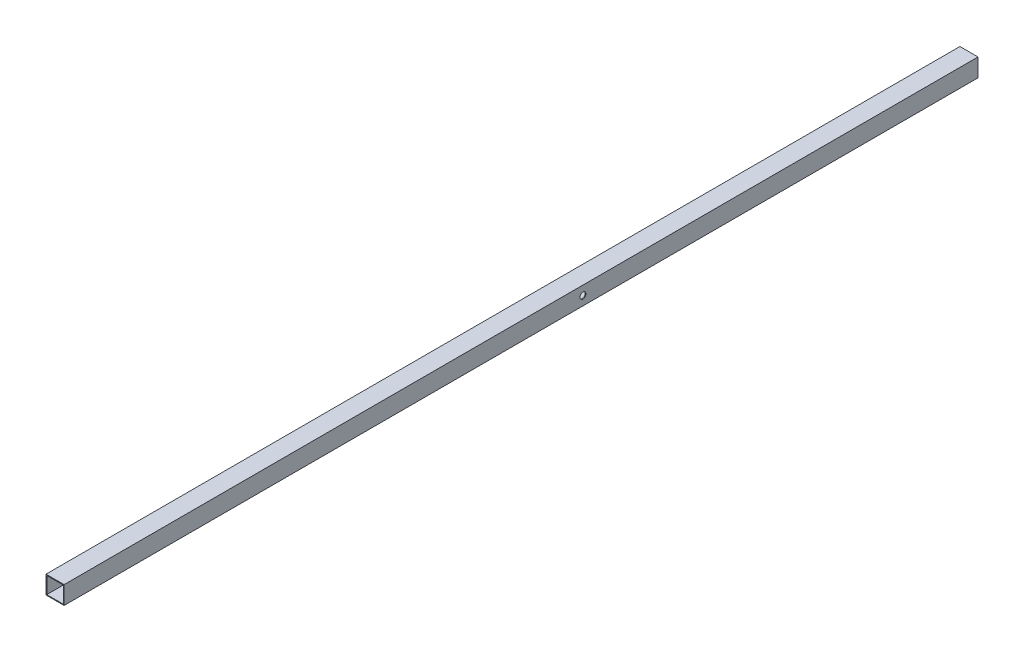
ISO-10303-21;
HEADER;
FILE_DESCRIPTION(('STEP AP214'),'2;1');
FILE_NAME('part.step','',(''),(''),'','','');
FILE_SCHEMA(('AUTOMOTIVE_DESIGN { 1 0 10303 214 1 1 1 1 }'));
ENDSEC;
DATA;
#1=APPLICATION_CONTEXT('core data for automotive mechanical design processes');
#2=APPLICATION_PROTOCOL_DEFINITION('international standard','automotive_design',2000,#1);
#3=PRODUCT_CONTEXT('',#1,'mechanical');
#4=PRODUCT('Part','Part','',(#3));
#5=PRODUCT_RELATED_PRODUCT_CATEGORY('part','',(#4));
#6=PRODUCT_DEFINITION_FORMATION('','',#4);
#7=PRODUCT_DEFINITION_CONTEXT('part definition',#1,'design');
#8=PRODUCT_DEFINITION('design','',#6,#7);
#9=PRODUCT_DEFINITION_SHAPE('','',#8);
#10=(LENGTH_UNIT() NAMED_UNIT(*) SI_UNIT(.MILLI.,.METRE.));
#11=(NAMED_UNIT(*) PLANE_ANGLE_UNIT() SI_UNIT($,.RADIAN.));
#12=(NAMED_UNIT(*) SI_UNIT($,.STERADIAN.) SOLID_ANGLE_UNIT());
#13=UNCERTAINTY_MEASURE_WITH_UNIT(LENGTH_MEASURE(1.E-05),#10,'distance_accuracy_value','');
#14=(GEOMETRIC_REPRESENTATION_CONTEXT(3) GLOBAL_UNCERTAINTY_ASSIGNED_CONTEXT((#13)) GLOBAL_UNIT_ASSIGNED_CONTEXT((#10,
#11,#12)) REPRESENTATION_CONTEXT('',''));
#15=CARTESIAN_POINT('',(0.,0.,0.));
#16=DIRECTION('',(0.,0.,1.));
#17=DIRECTION('',(1.,0.,0.));
#18=AXIS2_PLACEMENT_3D('',#15,#16,#17);
#19=CARTESIAN_POINT('',(0.,0.,1924.05));
#20=DIRECTION('',(0.,0.,-1.));
#21=DIRECTION('',(-1.,0.,0.));
#22=AXIS2_PLACEMENT_3D('',#19,#20,#21);
#23=PLANE('',#22);
#24=DIRECTION('',(0.,-1.,0.));
#25=VECTOR('',#24,1.);
#26=CARTESIAN_POINT('',(0.,0.,1924.05));
#27=LINE('',#26,#25);
#28=CARTESIAN_POINT('',(0.,38.1,1924.05));
#29=VERTEX_POINT('',#28);
#30=CARTESIAN_POINT('',(0.,0.,1924.05));
#31=VERTEX_POINT('',#30);
#32=EDGE_CURVE('E141',#29,#31,#27,.T.);
#33=ORIENTED_EDGE('',*,*,#32,.T.);
#34=DIRECTION('',(1.,0.,0.));
#35=VECTOR('',#34,1.);
#36=CARTESIAN_POINT('',(0.,0.,1924.05));
#37=LINE('',#36,#35);
#38=CARTESIAN_POINT('',(38.1,0.,1924.05));
#39=VERTEX_POINT('',#38);
#40=EDGE_CURVE('E144',#31,#39,#37,.T.);
#41=ORIENTED_EDGE('',*,*,#40,.T.);
#42=DIRECTION('',(0.,1.,0.));
#43=VECTOR('',#42,1.);
#44=CARTESIAN_POINT('',(38.1,0.,1924.05));
#45=LINE('',#44,#43);
#46=CARTESIAN_POINT('',(38.1,38.1,1924.05));
#47=VERTEX_POINT('',#46);
#48=EDGE_CURVE('E147',#39,#47,#45,.T.);
#49=ORIENTED_EDGE('',*,*,#48,.T.);
#50=DIRECTION('',(-1.,0.,0.));
#51=VECTOR('',#50,1.);
#52=CARTESIAN_POINT('',(0.,38.1,1924.05));
#53=LINE('',#52,#51);
#54=EDGE_CURVE('E149',#47,#29,#53,.T.);
#55=ORIENTED_EDGE('',*,*,#54,.T.);
#56=EDGE_LOOP('',(#33,#41,#49,#55));
#57=FACE_BOUND('',#56,.T.);
#58=DIRECTION('',(0.,-1.,0.));
#59=VECTOR('',#58,1.);
#60=CARTESIAN_POINT('',(1.5875,1.5875,1924.05));
#61=LINE('',#60,#59);
#62=CARTESIAN_POINT('',(1.5875,36.5125,1924.05));
#63=VERTEX_POINT('',#62);
#64=CARTESIAN_POINT('',(1.5875,1.5875,1924.05));
#65=VERTEX_POINT('',#64);
#66=EDGE_CURVE('E103',#63,#65,#61,.T.);
#67=ORIENTED_EDGE('',*,*,#66,.F.);
#68=DIRECTION('',(-1.,0.,0.));
#69=VECTOR('',#68,1.);
#70=CARTESIAN_POINT('',(1.5875,36.5125,1924.05));
#71=LINE('',#70,#69);
#72=CARTESIAN_POINT('',(36.5125,36.5125,1924.05));
#73=VERTEX_POINT('',#72);
#74=EDGE_CURVE('E125',#73,#63,#71,.T.);
#75=ORIENTED_EDGE('',*,*,#74,.F.);
#76=DIRECTION('',(0.,1.,0.));
#77=VECTOR('',#76,1.);
#78=CARTESIAN_POINT('',(36.5125,1.5875,1924.05));
#79=LINE('',#78,#77);
#80=CARTESIAN_POINT('',(36.5125,1.5875,1924.05));
#81=VERTEX_POINT('',#80);
#82=EDGE_CURVE('E123',#81,#73,#79,.T.);
#83=ORIENTED_EDGE('',*,*,#82,.F.);
#84=DIRECTION('',(1.,0.,0.));
#85=VECTOR('',#84,1.);
#86=CARTESIAN_POINT('',(1.5875,1.5875,1924.05));
#87=LINE('',#86,#85);
#88=EDGE_CURVE('E111',#65,#81,#87,.T.);
#89=ORIENTED_EDGE('',*,*,#88,.F.);
#90=EDGE_LOOP('',(#67,#75,#83,#89));
#91=FACE_BOUND('',#90,.T.);
#92=ADVANCED_FACE('F37',(#57,#91),#23,.F.);
#93=CARTESIAN_POINT('',(0.,0.,0.));
#94=DIRECTION('',(0.,0.,-1.));
#95=DIRECTION('',(-1.,0.,0.));
#96=AXIS2_PLACEMENT_3D('',#93,#94,#95);
#97=PLANE('',#96);
#98=DIRECTION('',(0.,-1.,0.));
#99=VECTOR('',#98,1.);
#100=CARTESIAN_POINT('',(0.,0.,0.));
#101=LINE('',#100,#99);
#102=CARTESIAN_POINT('',(0.,38.1,0.));
#103=VERTEX_POINT('',#102);
#104=CARTESIAN_POINT('',(0.,0.,0.));
#105=VERTEX_POINT('',#104);
#106=EDGE_CURVE('E119',#103,#105,#101,.T.);
#107=ORIENTED_EDGE('',*,*,#106,.F.);
#108=DIRECTION('',(-1.,0.,0.));
#109=VECTOR('',#108,1.);
#110=CARTESIAN_POINT('',(0.,38.1,0.));
#111=LINE('',#110,#109);
#112=CARTESIAN_POINT('',(38.1,38.1,0.));
#113=VERTEX_POINT('',#112);
#114=EDGE_CURVE('E145',#113,#103,#111,.T.);
#115=ORIENTED_EDGE('',*,*,#114,.F.);
#116=DIRECTION('',(0.,1.,0.));
#117=VECTOR('',#116,1.);
#118=CARTESIAN_POINT('',(38.1,0.,0.));
#119=LINE('',#118,#117);
#120=CARTESIAN_POINT('',(38.1,0.,0.));
#121=VERTEX_POINT('',#120);
#122=EDGE_CURVE('E156',#121,#113,#119,.T.);
#123=ORIENTED_EDGE('',*,*,#122,.F.);
#124=DIRECTION('',(1.,0.,0.));
#125=VECTOR('',#124,1.);
#126=CARTESIAN_POINT('',(0.,0.,0.));
#127=LINE('',#126,#125);
#128=EDGE_CURVE('E154',#105,#121,#127,.T.);
#129=ORIENTED_EDGE('',*,*,#128,.F.);
#130=EDGE_LOOP('',(#107,#115,#123,#129));
#131=FACE_BOUND('',#130,.T.);
#132=DIRECTION('',(-1.,0.,0.));
#133=VECTOR('',#132,1.);
#134=CARTESIAN_POINT('',(1.5875,36.5125,0.));
#135=LINE('',#134,#133);
#136=CARTESIAN_POINT('',(36.5125,36.5125,0.));
#137=VERTEX_POINT('',#136);
#138=CARTESIAN_POINT('',(1.5875,36.5125,0.));
#139=VERTEX_POINT('',#138);
#140=EDGE_CURVE('E112',#137,#139,#135,.T.);
#141=ORIENTED_EDGE('',*,*,#140,.T.);
#142=DIRECTION('',(0.,-1.,0.));
#143=VECTOR('',#142,1.);
#144=CARTESIAN_POINT('',(1.5875,1.5875,0.));
#145=LINE('',#144,#143);
#146=CARTESIAN_POINT('',(1.5875,1.5875,0.));
#147=VERTEX_POINT('',#146);
#148=EDGE_CURVE('E61',#139,#147,#145,.T.);
#149=ORIENTED_EDGE('',*,*,#148,.T.);
#150=DIRECTION('',(1.,0.,0.));
#151=VECTOR('',#150,1.);
#152=CARTESIAN_POINT('',(1.5875,1.5875,0.));
#153=LINE('',#152,#151);
#154=CARTESIAN_POINT('',(36.5125,1.5875,0.));
#155=VERTEX_POINT('',#154);
#156=EDGE_CURVE('E118',#147,#155,#153,.T.);
#157=ORIENTED_EDGE('',*,*,#156,.T.);
#158=DIRECTION('',(0.,1.,0.));
#159=VECTOR('',#158,1.);
#160=CARTESIAN_POINT('',(36.5125,1.5875,0.));
#161=LINE('',#160,#159);
#162=EDGE_CURVE('E133',#155,#137,#161,.T.);
#163=ORIENTED_EDGE('',*,*,#162,.T.);
#164=EDGE_LOOP('',(#141,#149,#157,#163));
#165=FACE_BOUND('',#164,.T.);
#166=ADVANCED_FACE('F175',(#131,#165),#97,.T.);
#167=CARTESIAN_POINT('',(0.,0.,1924.05));
#168=DIRECTION('',(1.,0.,0.));
#169=DIRECTION('',(0.,0.,-1.));
#170=AXIS2_PLACEMENT_3D('',#167,#168,#169);
#171=PLANE('',#170);
#172=CARTESIAN_POINT('',(0.,19.05,831.85));
#173=DIRECTION('',(-1.,0.,0.));
#174=DIRECTION('',(0.,0.,1.));
#175=AXIS2_PLACEMENT_3D('',#172,#173,#174);
#176=CIRCLE('',#175,6.34999999999999);
#177=CARTESIAN_POINT('',(0.,19.05,838.2));
#178=VERTEX_POINT('',#177);
#179=EDGE_CURVE('E220',#178,#178,#176,.T.);
#180=ORIENTED_EDGE('',*,*,#179,.F.);
#181=EDGE_LOOP('',(#180));
#182=FACE_BOUND('',#181,.T.);
#183=ORIENTED_EDGE('',*,*,#106,.T.);
#184=DIRECTION('',(0.,0.,-1.));
#185=VECTOR('',#184,1.);
#186=CARTESIAN_POINT('',(0.,0.,1924.05));
#187=LINE('',#186,#185);
#188=EDGE_CURVE('E11',#31,#105,#187,.T.);
#189=ORIENTED_EDGE('',*,*,#188,.F.);
#190=ORIENTED_EDGE('',*,*,#32,.F.);
#191=DIRECTION('',(0.,0.,-1.));
#192=VECTOR('',#191,1.);
#193=CARTESIAN_POINT('',(0.,38.1,1924.05));
#194=LINE('',#193,#192);
#195=EDGE_CURVE('E151',#29,#103,#194,.T.);
#196=ORIENTED_EDGE('',*,*,#195,.T.);
#197=EDGE_LOOP('',(#183,#189,#190,#196));
#198=FACE_BOUND('',#197,.T.);
#199=ADVANCED_FACE('F39',(#182,#198),#171,.F.);
#200=CARTESIAN_POINT('',(0.,0.,1924.05));
#201=DIRECTION('',(0.,1.,0.));
#202=DIRECTION('',(0.,0.,1.));
#203=AXIS2_PLACEMENT_3D('',#200,#201,#202);
#204=PLANE('',#203);
#205=ORIENTED_EDGE('',*,*,#128,.T.);
#206=DIRECTION('',(0.,0.,-1.));
#207=VECTOR('',#206,1.);
#208=CARTESIAN_POINT('',(38.1,0.,1924.05));
#209=LINE('',#208,#207);
#210=EDGE_CURVE('E46',#39,#121,#209,.T.);
#211=ORIENTED_EDGE('',*,*,#210,.F.);
#212=ORIENTED_EDGE('',*,*,#40,.F.);
#213=ORIENTED_EDGE('',*,*,#188,.T.);
#214=EDGE_LOOP('',(#205,#211,#212,#213));
#215=FACE_BOUND('',#214,.T.);
#216=ADVANCED_FACE('F185',(#215),#204,.F.);
#217=CARTESIAN_POINT('',(38.1,0.,1924.05));
#218=DIRECTION('',(-1.,0.,0.));
#219=DIRECTION('',(0.,0.,1.));
#220=AXIS2_PLACEMENT_3D('',#217,#218,#219);
#221=PLANE('',#220);
#222=CARTESIAN_POINT('',(38.1,19.05,831.85));
#223=DIRECTION('',(-1.,0.,0.));
#224=DIRECTION('',(0.,0.,1.));
#225=AXIS2_PLACEMENT_3D('',#222,#223,#224);
#226=CIRCLE('',#225,6.34999999999998);
#227=CARTESIAN_POINT('',(38.1,19.05,838.2));
#228=VERTEX_POINT('',#227);
#229=EDGE_CURVE('E216',#228,#228,#226,.T.);
#230=ORIENTED_EDGE('',*,*,#229,.T.);
#231=EDGE_LOOP('',(#230));
#232=FACE_BOUND('',#231,.T.);
#233=ORIENTED_EDGE('',*,*,#122,.T.);
#234=DIRECTION('',(0.,0.,-1.));
#235=VECTOR('',#234,1.);
#236=CARTESIAN_POINT('',(38.1,38.1,1924.05));
#237=LINE('',#236,#235);
#238=EDGE_CURVE('E161',#47,#113,#237,.T.);
#239=ORIENTED_EDGE('',*,*,#238,.F.);
#240=ORIENTED_EDGE('',*,*,#48,.F.);
#241=ORIENTED_EDGE('',*,*,#210,.T.);
#242=EDGE_LOOP('',(#233,#239,#240,#241));
#243=FACE_BOUND('',#242,.T.);
#244=ADVANCED_FACE('F169',(#232,#243),#221,.F.);
#245=CARTESIAN_POINT('',(0.,38.1,1924.05));
#246=DIRECTION('',(0.,-1.,0.));
#247=DIRECTION('',(0.,0.,-1.));
#248=AXIS2_PLACEMENT_3D('',#245,#246,#247);
#249=PLANE('',#248);
#250=ORIENTED_EDGE('',*,*,#114,.T.);
#251=ORIENTED_EDGE('',*,*,#195,.F.);
#252=ORIENTED_EDGE('',*,*,#54,.F.);
#253=ORIENTED_EDGE('',*,*,#238,.T.);
#254=EDGE_LOOP('',(#250,#251,#252,#253));
#255=FACE_BOUND('',#254,.T.);
#256=ADVANCED_FACE('F179',(#255),#249,.F.);
#257=CARTESIAN_POINT('',(1.5875,1.5875,1924.05));
#258=DIRECTION('',(1.,0.,0.));
#259=DIRECTION('',(0.,1.,0.));
#260=AXIS2_PLACEMENT_3D('',#257,#258,#259);
#261=PLANE('',#260);
#262=CARTESIAN_POINT('',(1.5875,19.05,831.85));
#263=DIRECTION('',(1.,0.,0.));
#264=DIRECTION('',(0.,1.,0.));
#265=AXIS2_PLACEMENT_3D('',#262,#263,#264);
#266=CIRCLE('',#265,6.34999999999999);
#267=CARTESIAN_POINT('',(1.5875,25.4,831.85));
#268=VERTEX_POINT('',#267);
#269=EDGE_CURVE('E131',#268,#268,#266,.T.);
#270=ORIENTED_EDGE('',*,*,#269,.F.);
#271=EDGE_LOOP('',(#270));
#272=FACE_BOUND('',#271,.T.);
#273=ORIENTED_EDGE('',*,*,#148,.F.);
#274=DIRECTION('',(0.,0.,-1.));
#275=VECTOR('',#274,1.);
#276=CARTESIAN_POINT('',(1.5875,36.5125,1924.05));
#277=LINE('',#276,#275);
#278=EDGE_CURVE('E107',#63,#139,#277,.T.);
#279=ORIENTED_EDGE('',*,*,#278,.F.);
#280=ORIENTED_EDGE('',*,*,#66,.T.);
#281=DIRECTION('',(0.,0.,-1.));
#282=VECTOR('',#281,1.);
#283=CARTESIAN_POINT('',(1.5875,1.5875,1924.05));
#284=LINE('',#283,#282);
#285=EDGE_CURVE('E106',#65,#147,#284,.T.);
#286=ORIENTED_EDGE('',*,*,#285,.T.);
#287=EDGE_LOOP('',(#273,#279,#280,#286));
#288=FACE_BOUND('',#287,.T.);
#289=ADVANCED_FACE('F105',(#272,#288),#261,.T.);
#290=CARTESIAN_POINT('',(1.5875,1.5875,1924.05));
#291=DIRECTION('',(0.,1.,0.));
#292=DIRECTION('',(0.,0.,1.));
#293=AXIS2_PLACEMENT_3D('',#290,#291,#292);
#294=PLANE('',#293);
#295=ORIENTED_EDGE('',*,*,#156,.F.);
#296=ORIENTED_EDGE('',*,*,#285,.F.);
#297=ORIENTED_EDGE('',*,*,#88,.T.);
#298=DIRECTION('',(0.,0.,-1.));
#299=VECTOR('',#298,1.);
#300=CARTESIAN_POINT('',(36.5125,1.5875,1924.05));
#301=LINE('',#300,#299);
#302=EDGE_CURVE('E120',#81,#155,#301,.T.);
#303=ORIENTED_EDGE('',*,*,#302,.T.);
#304=EDGE_LOOP('',(#295,#296,#297,#303));
#305=FACE_BOUND('',#304,.T.);
#306=ADVANCED_FACE('F115',(#305),#294,.T.);
#307=CARTESIAN_POINT('',(36.5125,1.5875,1924.05));
#308=DIRECTION('',(-1.,0.,0.));
#309=DIRECTION('',(0.,0.,1.));
#310=AXIS2_PLACEMENT_3D('',#307,#308,#309);
#311=PLANE('',#310);
#312=CARTESIAN_POINT('',(36.5125,19.05,831.85));
#313=DIRECTION('',(-1.,0.,0.));
#314=DIRECTION('',(0.,0.,1.));
#315=AXIS2_PLACEMENT_3D('',#312,#313,#314);
#316=CIRCLE('',#315,6.34999999999999);
#317=CARTESIAN_POINT('',(36.5125,19.05,838.2));
#318=VERTEX_POINT('',#317);
#319=EDGE_CURVE('E41',#318,#318,#316,.T.);
#320=ORIENTED_EDGE('',*,*,#319,.F.);
#321=EDGE_LOOP('',(#320));
#322=FACE_BOUND('',#321,.T.);
#323=ORIENTED_EDGE('',*,*,#162,.F.);
#324=ORIENTED_EDGE('',*,*,#302,.F.);
#325=ORIENTED_EDGE('',*,*,#82,.T.);
#326=DIRECTION('',(0.,0.,-1.));
#327=VECTOR('',#326,1.);
#328=CARTESIAN_POINT('',(36.5125,36.5125,1924.05));
#329=LINE('',#328,#327);
#330=EDGE_CURVE('E53',#73,#137,#329,.T.);
#331=ORIENTED_EDGE('',*,*,#330,.T.);
#332=EDGE_LOOP('',(#323,#324,#325,#331));
#333=FACE_BOUND('',#332,.T.);
#334=ADVANCED_FACE('F211',(#322,#333),#311,.T.);
#335=CARTESIAN_POINT('',(1.5875,36.5125,1924.05));
#336=DIRECTION('',(0.,-1.,0.));
#337=DIRECTION('',(0.,0.,-1.));
#338=AXIS2_PLACEMENT_3D('',#335,#336,#337);
#339=PLANE('',#338);
#340=ORIENTED_EDGE('',*,*,#140,.F.);
#341=ORIENTED_EDGE('',*,*,#330,.F.);
#342=ORIENTED_EDGE('',*,*,#74,.T.);
#343=ORIENTED_EDGE('',*,*,#278,.T.);
#344=EDGE_LOOP('',(#340,#341,#342,#343));
#345=FACE_BOUND('',#344,.T.);
#346=ADVANCED_FACE('F231',(#345),#339,.T.);
#347=CARTESIAN_POINT('',(0.,19.05,831.85));
#348=DIRECTION('',(-1.,0.,0.));
#349=DIRECTION('',(0.,0.,1.));
#350=AXIS2_PLACEMENT_3D('',#347,#348,#349);
#351=CYLINDRICAL_SURFACE('',#350,6.34999999999999);
#352=ORIENTED_EDGE('',*,*,#319,.T.);
#353=EDGE_LOOP('',(#352));
#354=FACE_BOUND('',#353,.T.);
#355=ORIENTED_EDGE('',*,*,#229,.F.);
#356=EDGE_LOOP('',(#355));
#357=FACE_BOUND('',#356,.T.);
#358=ADVANCED_FACE('F226',(#354,#357),#351,.F.);
#359=ORIENTED_EDGE('',*,*,#269,.T.);
#360=EDGE_LOOP('',(#359));
#361=FACE_BOUND('',#360,.T.);
#362=ORIENTED_EDGE('',*,*,#179,.T.);
#363=EDGE_LOOP('',(#362));
#364=FACE_BOUND('',#363,.T.);
#365=ADVANCED_FACE('F224',(#361,#364),#351,.F.);
#366=CLOSED_SHELL('',(#92,#166,#199,#216,#244,#256,#289,#306,#334,#346,#358,#365));
#367=MANIFOLD_SOLID_BREP('B2',#366);
#368=ADVANCED_BREP_SHAPE_REPRESENTATION('',(#18,#367),#14);
#369=SHAPE_DEFINITION_REPRESENTATION(#9,#368);
ENDSEC;
END-ISO-10303-21;
